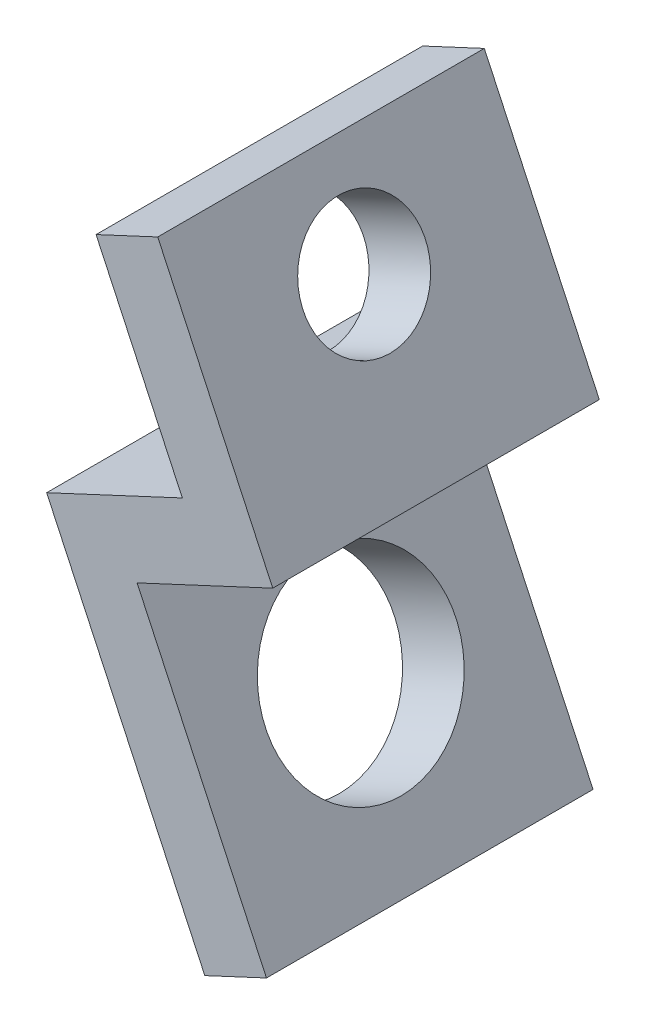
ISO-10303-21;
HEADER;
FILE_DESCRIPTION(('STEP AP214'),'2;1');
FILE_NAME('part.step','',(''),(''),'','','');
FILE_SCHEMA(('AUTOMOTIVE_DESIGN { 1 0 10303 214 1 1 1 1 }'));
ENDSEC;
DATA;
#1=APPLICATION_CONTEXT('core data for automotive mechanical design processes');
#2=APPLICATION_PROTOCOL_DEFINITION('international standard','automotive_design',2000,#1);
#3=PRODUCT_CONTEXT('',#1,'mechanical');
#4=PRODUCT('Part','Part','',(#3));
#5=PRODUCT_RELATED_PRODUCT_CATEGORY('part','',(#4));
#6=PRODUCT_DEFINITION_FORMATION('','',#4);
#7=PRODUCT_DEFINITION_CONTEXT('part definition',#1,'design');
#8=PRODUCT_DEFINITION('design','',#6,#7);
#9=PRODUCT_DEFINITION_SHAPE('','',#8);
#10=(LENGTH_UNIT() NAMED_UNIT(*) SI_UNIT(.MILLI.,.METRE.));
#11=(NAMED_UNIT(*) PLANE_ANGLE_UNIT() SI_UNIT($,.RADIAN.));
#12=(NAMED_UNIT(*) SI_UNIT($,.STERADIAN.) SOLID_ANGLE_UNIT());
#13=UNCERTAINTY_MEASURE_WITH_UNIT(LENGTH_MEASURE(1.E-05),#10,'distance_accuracy_value','');
#14=(GEOMETRIC_REPRESENTATION_CONTEXT(3) GLOBAL_UNCERTAINTY_ASSIGNED_CONTEXT((#13)) GLOBAL_UNIT_ASSIGNED_CONTEXT((#10,
#11,#12)) REPRESENTATION_CONTEXT('',''));
#15=CARTESIAN_POINT('',(0.,0.,0.));
#16=DIRECTION('',(0.,0.,1.));
#17=DIRECTION('',(1.,0.,0.));
#18=AXIS2_PLACEMENT_3D('',#15,#16,#17);
#19=CARTESIAN_POINT('',(-139.002235499064,21.2456707651997,12.));
#20=DIRECTION('',(-0.906307787036649,-0.422618261740701,0.));
#21=DIRECTION('',(0.422618261740701,-0.906307787036649,0.));
#22=AXIS2_PLACEMENT_3D('',#19,#20,#21);
#23=PLANE('',#22);
#24=CARTESIAN_POINT('',(-135.832598536008,14.448362362424,0.));
#25=DIRECTION('',(-0.906307787036649,-0.422618261740701,0.));
#26=DIRECTION('',(0.422618261740701,-0.906307787036649,0.));
#27=AXIS2_PLACEMENT_3D('',#24,#25,#26);
#28=CIRCLE('',#27,4.49999999999997);
#29=CARTESIAN_POINT('',(-133.930816358175,10.3699773207591,0.));
#30=VERTEX_POINT('',#29);
#31=EDGE_CURVE('E183',#30,#30,#28,.T.);
#32=ORIENTED_EDGE('',*,*,#31,.T.);
#33=EDGE_LOOP('',(#32));
#34=FACE_BOUND('',#33,.T.);
#35=DIRECTION('',(-0.422618261740701,0.906307787036649,0.));
#36=VECTOR('',#35,1.);
#37=CARTESIAN_POINT('',(-139.002235499064,21.2456707651997,-12.));
#38=LINE('',#37,#36);
#39=CARTESIAN_POINT('',(-130.54987026425,3.11951502446581,-12.));
#40=VERTEX_POINT('',#39);
#41=CARTESIAN_POINT('',(-139.002235499064,21.2456707651997,-12.));
#42=VERTEX_POINT('',#41);
#43=EDGE_CURVE('E132',#40,#42,#38,.T.);
#44=ORIENTED_EDGE('',*,*,#43,.T.);
#45=DIRECTION('',(0.,0.,-1.));
#46=VECTOR('',#45,1.);
#47=CARTESIAN_POINT('',(-139.002235499064,21.2456707651997,12.));
#48=LINE('',#47,#46);
#49=CARTESIAN_POINT('',(-139.002235499064,21.2456707651997,12.));
#50=VERTEX_POINT('',#49);
#51=EDGE_CURVE('E11',#50,#42,#48,.T.);
#52=ORIENTED_EDGE('',*,*,#51,.F.);
#53=DIRECTION('',(-0.422618261740701,0.906307787036649,0.));
#54=VECTOR('',#53,1.);
#55=CARTESIAN_POINT('',(-139.002235499064,21.2456707651997,12.));
#56=LINE('',#55,#54);
#57=CARTESIAN_POINT('',(-130.54987026425,3.11951502446581,12.));
#58=VERTEX_POINT('',#57);
#59=EDGE_CURVE('E146',#58,#50,#56,.T.);
#60=ORIENTED_EDGE('',*,*,#59,.F.);
#61=DIRECTION('',(0.,0.,-1.));
#62=VECTOR('',#61,1.);
#63=CARTESIAN_POINT('',(-130.54987026425,3.11951502446581,12.));
#64=LINE('',#63,#62);
#65=EDGE_CURVE('E128',#58,#40,#64,.T.);
#66=ORIENTED_EDGE('',*,*,#65,.T.);
#67=EDGE_LOOP('',(#44,#52,#60,#66));
#68=FACE_BOUND('',#67,.T.);
#69=ADVANCED_FACE('F35',(#34,#68),#23,.F.);
#70=CARTESIAN_POINT('',(-143.533774434247,19.1325794564962,12.));
#71=DIRECTION('',(0.422618261740703,-0.906307787036648,0.));
#72=DIRECTION('',(0.906307787036648,0.422618261740703,0.));
#73=AXIS2_PLACEMENT_3D('',#70,#71,#72);
#74=PLANE('',#73);
#75=DIRECTION('',(-0.906307787036648,-0.422618261740703,0.));
#76=VECTOR('',#75,1.);
#77=CARTESIAN_POINT('',(-143.533774434247,19.1325794564962,-12.));
#78=LINE('',#77,#76);
#79=CARTESIAN_POINT('',(-143.533774434247,19.1325794564962,-12.));
#80=VERTEX_POINT('',#79);
#81=EDGE_CURVE('E135',#42,#80,#78,.T.);
#82=ORIENTED_EDGE('',*,*,#81,.T.);
#83=DIRECTION('',(0.,0.,-1.));
#84=VECTOR('',#83,1.);
#85=CARTESIAN_POINT('',(-143.533774434247,19.1325794564962,12.));
#86=LINE('',#85,#84);
#87=CARTESIAN_POINT('',(-143.533774434247,19.1325794564962,12.));
#88=VERTEX_POINT('',#87);
#89=EDGE_CURVE('E44',#88,#80,#86,.T.);
#90=ORIENTED_EDGE('',*,*,#89,.F.);
#91=DIRECTION('',(-0.906307787036648,-0.422618261740703,0.));
#92=VECTOR('',#91,1.);
#93=CARTESIAN_POINT('',(-143.533774434247,19.1325794564962,12.));
#94=LINE('',#93,#92);
#95=EDGE_CURVE('E95',#50,#88,#94,.T.);
#96=ORIENTED_EDGE('',*,*,#95,.F.);
#97=ORIENTED_EDGE('',*,*,#51,.T.);
#98=EDGE_LOOP('',(#82,#90,#96,#97));
#99=FACE_BOUND('',#98,.T.);
#100=ADVANCED_FACE('F194',(#99),#74,.F.);
#101=CARTESIAN_POINT('',(-137.194500508136,5.53796265094559,12.));
#102=DIRECTION('',(0.906307787036639,0.422618261740723,0.));
#103=DIRECTION('',(-0.422618261740723,0.906307787036639,0.));
#104=AXIS2_PLACEMENT_3D('',#101,#102,#103);
#105=PLANE('',#104);
#106=CARTESIAN_POINT('',(-140.364137471193,12.3352710537194,0.));
#107=DIRECTION('',(-0.906307787036626,-0.422618261740751,0.));
#108=DIRECTION('',(0.422618261740751,-0.906307787036626,0.));
#109=AXIS2_PLACEMENT_3D('',#106,#107,#108);
#110=CIRCLE('',#109,4.49999999999998);
#111=CARTESIAN_POINT('',(-138.46235529336,8.25688601205458,0.));
#112=VERTEX_POINT('',#111);
#113=EDGE_CURVE('E186',#112,#112,#110,.T.);
#114=ORIENTED_EDGE('',*,*,#113,.F.);
#115=EDGE_LOOP('',(#114));
#116=FACE_BOUND('',#115,.T.);
#117=DIRECTION('',(0.422618261740723,-0.906307787036639,0.));
#118=VECTOR('',#117,1.);
#119=CARTESIAN_POINT('',(-137.194500508136,5.53796265094559,-12.));
#120=LINE('',#119,#118);
#121=CARTESIAN_POINT('',(-137.194500508136,5.53796265094559,-12.));
#122=VERTEX_POINT('',#121);
#123=EDGE_CURVE('E137',#80,#122,#120,.T.);
#124=ORIENTED_EDGE('',*,*,#123,.T.);
#125=DIRECTION('',(0.,0.,-1.));
#126=VECTOR('',#125,1.);
#127=CARTESIAN_POINT('',(-137.194500508136,5.53796265094559,12.));
#128=LINE('',#127,#126);
#129=CARTESIAN_POINT('',(-137.194500508136,5.53796265094559,12.));
#130=VERTEX_POINT('',#129);
#131=EDGE_CURVE('E153',#130,#122,#128,.T.);
#132=ORIENTED_EDGE('',*,*,#131,.F.);
#133=DIRECTION('',(0.422618261740723,-0.906307787036639,0.));
#134=VECTOR('',#133,1.);
#135=CARTESIAN_POINT('',(-137.194500508136,5.53796265094559,12.));
#136=LINE('',#135,#134);
#137=EDGE_CURVE('E162',#88,#130,#136,.T.);
#138=ORIENTED_EDGE('',*,*,#137,.F.);
#139=ORIENTED_EDGE('',*,*,#89,.T.);
#140=EDGE_LOOP('',(#124,#132,#138,#139));
#141=FACE_BOUND('',#140,.T.);
#142=ADVANCED_FACE('F160',(#116,#141),#105,.F.);
#143=CARTESIAN_POINT('',(-147.163886165539,0.889161771797776,12.));
#144=DIRECTION('',(0.422618261740701,-0.906307787036649,0.));
#145=DIRECTION('',(0.906307787036649,0.422618261740701,0.));
#146=AXIS2_PLACEMENT_3D('',#143,#144,#145);
#147=PLANE('',#146);
#148=DIRECTION('',(-0.906307787036649,-0.422618261740701,0.));
#149=VECTOR('',#148,1.);
#150=CARTESIAN_POINT('',(-147.163886165539,0.889161771797776,-12.));
#151=LINE('',#150,#149);
#152=CARTESIAN_POINT('',(-147.163886165539,0.889161771797776,-12.));
#153=VERTEX_POINT('',#152);
#154=EDGE_CURVE('E139',#122,#153,#151,.T.);
#155=ORIENTED_EDGE('',*,*,#154,.T.);
#156=DIRECTION('',(0.,0.,-1.));
#157=VECTOR('',#156,1.);
#158=CARTESIAN_POINT('',(-147.163886165539,0.889161771797776,12.));
#159=LINE('',#158,#157);
#160=CARTESIAN_POINT('',(-147.163886165539,0.889161771797776,12.));
#161=VERTEX_POINT('',#160);
#162=EDGE_CURVE('E150',#161,#153,#159,.T.);
#163=ORIENTED_EDGE('',*,*,#162,.F.);
#164=DIRECTION('',(-0.906307787036649,-0.422618261740701,0.));
#165=VECTOR('',#164,1.);
#166=CARTESIAN_POINT('',(-147.163886165539,0.889161771797776,12.));
#167=LINE('',#166,#165);
#168=EDGE_CURVE('E174',#130,#161,#167,.T.);
#169=ORIENTED_EDGE('',*,*,#168,.F.);
#170=ORIENTED_EDGE('',*,*,#131,.T.);
#171=EDGE_LOOP('',(#155,#163,#169,#170));
#172=FACE_BOUND('',#171,.T.);
#173=ADVANCED_FACE('F170',(#172),#147,.F.);
#174=CARTESIAN_POINT('',(-135.541883967669,-24.0343023717121,12.));
#175=DIRECTION('',(0.906307787036649,0.422618261740702,0.));
#176=DIRECTION('',(-0.422618261740702,0.906307787036649,0.));
#177=AXIS2_PLACEMENT_3D('',#174,#175,#176);
#178=PLANE('',#177);
#179=CARTESIAN_POINT('',(-140.613303108557,-13.1586089272724,0.));
#180=DIRECTION('',(-0.90630778703665,-0.422618261740699,0.));
#181=DIRECTION('',(0.422618261740699,-0.90630778703665,0.));
#182=AXIS2_PLACEMENT_3D('',#179,#180,#181);
#183=CIRCLE('',#182,7.);
#184=CARTESIAN_POINT('',(-137.654975276373,-19.502763436529,0.));
#185=VERTEX_POINT('',#184);
#186=EDGE_CURVE('E180',#185,#185,#183,.T.);
#187=ORIENTED_EDGE('',*,*,#186,.F.);
#188=EDGE_LOOP('',(#187));
#189=FACE_BOUND('',#188,.T.);
#190=DIRECTION('',(0.422618261740702,-0.906307787036649,0.));
#191=VECTOR('',#190,1.);
#192=CARTESIAN_POINT('',(-135.541883967669,-24.0343023717121,-12.));
#193=LINE('',#192,#191);
#194=CARTESIAN_POINT('',(-135.541883967669,-24.0343023717121,-12.));
#195=VERTEX_POINT('',#194);
#196=EDGE_CURVE('E141',#153,#195,#193,.T.);
#197=ORIENTED_EDGE('',*,*,#196,.T.);
#198=DIRECTION('',(0.,0.,-1.));
#199=VECTOR('',#198,1.);
#200=CARTESIAN_POINT('',(-135.541883967669,-24.0343023717121,12.));
#201=LINE('',#200,#199);
#202=CARTESIAN_POINT('',(-135.541883967669,-24.0343023717121,12.));
#203=VERTEX_POINT('',#202);
#204=EDGE_CURVE('E123',#203,#195,#201,.T.);
#205=ORIENTED_EDGE('',*,*,#204,.F.);
#206=DIRECTION('',(0.422618261740702,-0.906307787036649,0.));
#207=VECTOR('',#206,1.);
#208=CARTESIAN_POINT('',(-135.541883967669,-24.0343023717121,12.));
#209=LINE('',#208,#207);
#210=EDGE_CURVE('E114',#161,#203,#209,.T.);
#211=ORIENTED_EDGE('',*,*,#210,.F.);
#212=ORIENTED_EDGE('',*,*,#162,.T.);
#213=EDGE_LOOP('',(#197,#205,#211,#212));
#214=FACE_BOUND('',#213,.T.);
#215=ADVANCED_FACE('F173',(#189,#214),#178,.F.);
#216=CARTESIAN_POINT('',(-131.010345032486,-21.9212110630086,12.));
#217=DIRECTION('',(-0.422618261740703,0.906307787036648,0.));
#218=DIRECTION('',(-0.906307787036648,-0.422618261740703,0.));
#219=AXIS2_PLACEMENT_3D('',#216,#217,#218);
#220=PLANE('',#219);
#221=DIRECTION('',(0.906307787036648,0.422618261740703,0.));
#222=VECTOR('',#221,1.);
#223=CARTESIAN_POINT('',(-131.010345032486,-21.9212110630086,-12.));
#224=LINE('',#223,#222);
#225=CARTESIAN_POINT('',(-131.010345032486,-21.9212110630086,-12.));
#226=VERTEX_POINT('',#225);
#227=EDGE_CURVE('E122',#195,#226,#224,.T.);
#228=ORIENTED_EDGE('',*,*,#227,.T.);
#229=DIRECTION('',(0.,0.,-1.));
#230=VECTOR('',#229,1.);
#231=CARTESIAN_POINT('',(-131.010345032486,-21.9212110630086,12.));
#232=LINE('',#231,#230);
#233=CARTESIAN_POINT('',(-131.010345032486,-21.9212110630086,12.));
#234=VERTEX_POINT('',#233);
#235=EDGE_CURVE('E119',#234,#226,#232,.T.);
#236=ORIENTED_EDGE('',*,*,#235,.F.);
#237=DIRECTION('',(0.906307787036648,0.422618261740703,0.));
#238=VECTOR('',#237,1.);
#239=CARTESIAN_POINT('',(-131.010345032486,-21.9212110630086,12.));
#240=LINE('',#239,#238);
#241=EDGE_CURVE('E108',#203,#234,#240,.T.);
#242=ORIENTED_EDGE('',*,*,#241,.F.);
#243=ORIENTED_EDGE('',*,*,#204,.T.);
#244=EDGE_LOOP('',(#228,#236,#242,#243));
#245=FACE_BOUND('',#244,.T.);
#246=ADVANCED_FACE('F120',(#245),#220,.F.);
#247=CARTESIAN_POINT('',(-140.519255921653,-1.52928585468183,12.));
#248=DIRECTION('',(-0.906307787036649,-0.422618261740701,0.));
#249=DIRECTION('',(0.422618261740701,-0.906307787036649,0.));
#250=AXIS2_PLACEMENT_3D('',#247,#248,#249);
#251=PLANE('',#250);
#252=CARTESIAN_POINT('',(-136.081764173374,-11.045517618569,0.));
#253=DIRECTION('',(-0.906307787036649,-0.422618261740701,0.));
#254=DIRECTION('',(0.422618261740701,-0.906307787036649,0.));
#255=AXIS2_PLACEMENT_3D('',#252,#253,#254);
#256=CIRCLE('',#255,7.);
#257=CARTESIAN_POINT('',(-133.123436341189,-17.3896721278255,0.));
#258=VERTEX_POINT('',#257);
#259=EDGE_CURVE('E38',#258,#258,#256,.T.);
#260=ORIENTED_EDGE('',*,*,#259,.T.);
#261=EDGE_LOOP('',(#260));
#262=FACE_BOUND('',#261,.T.);
#263=DIRECTION('',(-0.422618261740701,0.906307787036649,0.));
#264=VECTOR('',#263,1.);
#265=CARTESIAN_POINT('',(-140.519255921653,-1.52928585468183,-12.));
#266=LINE('',#265,#264);
#267=CARTESIAN_POINT('',(-140.519255921653,-1.52928585468183,-12.));
#268=VERTEX_POINT('',#267);
#269=EDGE_CURVE('E81',#226,#268,#266,.T.);
#270=ORIENTED_EDGE('',*,*,#269,.T.);
#271=DIRECTION('',(0.,0.,-1.));
#272=VECTOR('',#271,1.);
#273=CARTESIAN_POINT('',(-140.519255921653,-1.52928585468183,12.));
#274=LINE('',#273,#272);
#275=CARTESIAN_POINT('',(-140.519255921653,-1.52928585468183,12.));
#276=VERTEX_POINT('',#275);
#277=EDGE_CURVE('E124',#276,#268,#274,.T.);
#278=ORIENTED_EDGE('',*,*,#277,.F.);
#279=DIRECTION('',(-0.422618261740701,0.906307787036649,0.));
#280=VECTOR('',#279,1.);
#281=CARTESIAN_POINT('',(-140.519255921653,-1.52928585468183,12.));
#282=LINE('',#281,#280);
#283=EDGE_CURVE('E112',#234,#276,#282,.T.);
#284=ORIENTED_EDGE('',*,*,#283,.F.);
#285=ORIENTED_EDGE('',*,*,#235,.T.);
#286=EDGE_LOOP('',(#270,#278,#284,#285));
#287=FACE_BOUND('',#286,.T.);
#288=ADVANCED_FACE('F126',(#262,#287),#251,.F.);
#289=CARTESIAN_POINT('',(-130.54987026425,3.11951502446581,12.));
#290=DIRECTION('',(-0.422618261740699,0.90630778703665,0.));
#291=DIRECTION('',(-0.90630778703665,-0.422618261740699,0.));
#292=AXIS2_PLACEMENT_3D('',#289,#290,#291);
#293=PLANE('',#292);
#294=DIRECTION('',(0.90630778703665,0.422618261740699,0.));
#295=VECTOR('',#294,1.);
#296=CARTESIAN_POINT('',(-130.54987026425,3.11951502446581,-12.));
#297=LINE('',#296,#295);
#298=EDGE_CURVE('E87',#268,#40,#297,.T.);
#299=ORIENTED_EDGE('',*,*,#298,.T.);
#300=ORIENTED_EDGE('',*,*,#65,.F.);
#301=DIRECTION('',(0.90630778703665,0.422618261740699,0.));
#302=VECTOR('',#301,1.);
#303=CARTESIAN_POINT('',(-130.54987026425,3.11951502446581,12.));
#304=LINE('',#303,#302);
#305=EDGE_CURVE('E52',#276,#58,#304,.T.);
#306=ORIENTED_EDGE('',*,*,#305,.F.);
#307=ORIENTED_EDGE('',*,*,#277,.T.);
#308=EDGE_LOOP('',(#299,#300,#306,#307));
#309=FACE_BOUND('',#308,.T.);
#310=ADVANCED_FACE('F209',(#309),#293,.F.);
#311=CARTESIAN_POINT('',(0.,0.,12.));
#312=DIRECTION('',(0.,0.,-1.));
#313=DIRECTION('',(-1.,0.,0.));
#314=AXIS2_PLACEMENT_3D('',#311,#312,#313);
#315=PLANE('',#314);
#316=ORIENTED_EDGE('',*,*,#59,.T.);
#317=ORIENTED_EDGE('',*,*,#95,.T.);
#318=ORIENTED_EDGE('',*,*,#137,.T.);
#319=ORIENTED_EDGE('',*,*,#168,.T.);
#320=ORIENTED_EDGE('',*,*,#210,.T.);
#321=ORIENTED_EDGE('',*,*,#241,.T.);
#322=ORIENTED_EDGE('',*,*,#283,.T.);
#323=ORIENTED_EDGE('',*,*,#305,.T.);
#324=EDGE_LOOP('',(#316,#317,#318,#319,#320,#321,#322,#323));
#325=FACE_BOUND('',#324,.T.);
#326=ADVANCED_FACE('F110',(#325),#315,.F.);
#327=CARTESIAN_POINT('',(0.,0.,-12.));
#328=DIRECTION('',(0.,0.,-1.));
#329=DIRECTION('',(-1.,0.,0.));
#330=AXIS2_PLACEMENT_3D('',#327,#328,#329);
#331=PLANE('',#330);
#332=ORIENTED_EDGE('',*,*,#43,.F.);
#333=ORIENTED_EDGE('',*,*,#298,.F.);
#334=ORIENTED_EDGE('',*,*,#269,.F.);
#335=ORIENTED_EDGE('',*,*,#227,.F.);
#336=ORIENTED_EDGE('',*,*,#196,.F.);
#337=ORIENTED_EDGE('',*,*,#154,.F.);
#338=ORIENTED_EDGE('',*,*,#123,.F.);
#339=ORIENTED_EDGE('',*,*,#81,.F.);
#340=EDGE_LOOP('',(#332,#333,#334,#335,#336,#337,#338,#339));
#341=FACE_BOUND('',#340,.T.);
#342=ADVANCED_FACE('F166',(#341),#331,.T.);
#343=CARTESIAN_POINT('',(-140.613303108557,-13.1586089272724,0.));
#344=DIRECTION('',(-0.90630778703665,-0.422618261740699,0.));
#345=DIRECTION('',(0.422618261740699,-0.90630778703665,0.));
#346=AXIS2_PLACEMENT_3D('',#343,#344,#345);
#347=CYLINDRICAL_SURFACE('',#346,7.);
#348=ORIENTED_EDGE('',*,*,#186,.T.);
#349=EDGE_LOOP('',(#348));
#350=FACE_BOUND('',#349,.T.);
#351=ORIENTED_EDGE('',*,*,#259,.F.);
#352=EDGE_LOOP('',(#351));
#353=FACE_BOUND('',#352,.T.);
#354=ADVANCED_FACE('F229',(#350,#353),#347,.F.);
#355=CARTESIAN_POINT('',(-140.364137471193,12.3352710537194,0.));
#356=DIRECTION('',(-0.906307787036626,-0.422618261740751,0.));
#357=DIRECTION('',(0.422618261740751,-0.906307787036626,0.));
#358=AXIS2_PLACEMENT_3D('',#355,#356,#357);
#359=CYLINDRICAL_SURFACE('',#358,4.49999999999997);
#360=ORIENTED_EDGE('',*,*,#113,.T.);
#361=EDGE_LOOP('',(#360));
#362=FACE_BOUND('',#361,.T.);
#363=ORIENTED_EDGE('',*,*,#31,.F.);
#364=EDGE_LOOP('',(#363));
#365=FACE_BOUND('',#364,.T.);
#366=ADVANCED_FACE('F190',(#362,#365),#359,.F.);
#367=CLOSED_SHELL('',(#69,#100,#142,#173,#215,#246,#288,#310,#326,#342,#354,#366));
#368=MANIFOLD_SOLID_BREP('B2',#367);
#369=ADVANCED_BREP_SHAPE_REPRESENTATION('',(#18,#368),#14);
#370=SHAPE_DEFINITION_REPRESENTATION(#9,#369);
ENDSEC;
END-ISO-10303-21;
